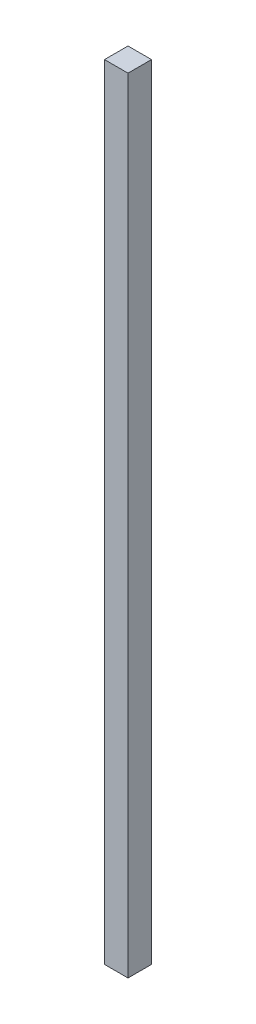
ISO-10303-21;
HEADER;
FILE_DESCRIPTION(('STEP AP214'),'2;1');
FILE_NAME('part.step','',(''),(''),'','','');
FILE_SCHEMA(('AUTOMOTIVE_DESIGN { 1 0 10303 214 1 1 1 1 }'));
ENDSEC;
DATA;
#1=APPLICATION_CONTEXT('core data for automotive mechanical design processes');
#2=APPLICATION_PROTOCOL_DEFINITION('international standard','automotive_design',2000,#1);
#3=PRODUCT_CONTEXT('',#1,'mechanical');
#4=PRODUCT('Part','Part','',(#3));
#5=PRODUCT_RELATED_PRODUCT_CATEGORY('part','',(#4));
#6=PRODUCT_DEFINITION_FORMATION('','',#4);
#7=PRODUCT_DEFINITION_CONTEXT('part definition',#1,'design');
#8=PRODUCT_DEFINITION('design','',#6,#7);
#9=PRODUCT_DEFINITION_SHAPE('','',#8);
#10=(LENGTH_UNIT() NAMED_UNIT(*) SI_UNIT(.MILLI.,.METRE.));
#11=(NAMED_UNIT(*) PLANE_ANGLE_UNIT() SI_UNIT($,.RADIAN.));
#12=(NAMED_UNIT(*) SI_UNIT($,.STERADIAN.) SOLID_ANGLE_UNIT());
#13=UNCERTAINTY_MEASURE_WITH_UNIT(LENGTH_MEASURE(1.E-05),#10,'distance_accuracy_value','');
#14=(GEOMETRIC_REPRESENTATION_CONTEXT(3) GLOBAL_UNCERTAINTY_ASSIGNED_CONTEXT((#13)) GLOBAL_UNIT_ASSIGNED_CONTEXT((#10,
#11,#12)) REPRESENTATION_CONTEXT('',''));
#15=CARTESIAN_POINT('',(0.,0.,0.));
#16=DIRECTION('',(0.,0.,1.));
#17=DIRECTION('',(1.,0.,0.));
#18=AXIS2_PLACEMENT_3D('',#15,#16,#17);
#19=CARTESIAN_POINT('',(0.,1000.,0.));
#20=DIRECTION('',(1.,0.,0.));
#21=DIRECTION('',(0.,0.,-1.));
#22=AXIS2_PLACEMENT_3D('',#19,#20,#21);
#23=PLANE('',#22);
#24=DIRECTION('',(0.,0.,1.));
#25=VECTOR('',#24,1.);
#26=CARTESIAN_POINT('',(0.,0.,0.));
#27=LINE('',#26,#25);
#28=CARTESIAN_POINT('',(0.,0.,-30.));
#29=VERTEX_POINT('',#28);
#30=CARTESIAN_POINT('',(0.,0.,0.));
#31=VERTEX_POINT('',#30);
#32=EDGE_CURVE('E107',#29,#31,#27,.T.);
#33=ORIENTED_EDGE('',*,*,#32,.T.);
#34=DIRECTION('',(0.,-1.,0.));
#35=VECTOR('',#34,1.);
#36=CARTESIAN_POINT('',(0.,1000.,0.));
#37=LINE('',#36,#35);
#38=CARTESIAN_POINT('',(0.,1000.,0.));
#39=VERTEX_POINT('',#38);
#40=EDGE_CURVE('E11',#39,#31,#37,.T.);
#41=ORIENTED_EDGE('',*,*,#40,.F.);
#42=DIRECTION('',(0.,0.,1.));
#43=VECTOR('',#42,1.);
#44=CARTESIAN_POINT('',(0.,1000.,0.));
#45=LINE('',#44,#43);
#46=CARTESIAN_POINT('',(0.,1000.,-30.));
#47=VERTEX_POINT('',#46);
#48=EDGE_CURVE('E91',#47,#39,#45,.T.);
#49=ORIENTED_EDGE('',*,*,#48,.F.);
#50=DIRECTION('',(0.,-1.,0.));
#51=VECTOR('',#50,1.);
#52=CARTESIAN_POINT('',(0.,1000.,-30.));
#53=LINE('',#52,#51);
#54=EDGE_CURVE('E103',#47,#29,#53,.T.);
#55=ORIENTED_EDGE('',*,*,#54,.T.);
#56=EDGE_LOOP('',(#33,#41,#49,#55));
#57=FACE_BOUND('',#56,.T.);
#58=ADVANCED_FACE('F39',(#57),#23,.F.);
#59=CARTESIAN_POINT('',(0.,1000.,0.));
#60=DIRECTION('',(0.,0.,-1.));
#61=DIRECTION('',(-1.,0.,0.));
#62=AXIS2_PLACEMENT_3D('',#59,#60,#61);
#63=PLANE('',#62);
#64=DIRECTION('',(1.,0.,0.));
#65=VECTOR('',#64,1.);
#66=CARTESIAN_POINT('',(0.,0.,0.));
#67=LINE('',#66,#65);
#68=CARTESIAN_POINT('',(30.,0.,0.));
#69=VERTEX_POINT('',#68);
#70=EDGE_CURVE('E96',#31,#69,#67,.T.);
#71=ORIENTED_EDGE('',*,*,#70,.T.);
#72=DIRECTION('',(0.,-1.,0.));
#73=VECTOR('',#72,1.);
#74=CARTESIAN_POINT('',(30.,1000.,0.));
#75=LINE('',#74,#73);
#76=CARTESIAN_POINT('',(30.,1000.,0.));
#77=VERTEX_POINT('',#76);
#78=EDGE_CURVE('E48',#77,#69,#75,.T.);
#79=ORIENTED_EDGE('',*,*,#78,.F.);
#80=DIRECTION('',(1.,0.,0.));
#81=VECTOR('',#80,1.);
#82=CARTESIAN_POINT('',(0.,1000.,0.));
#83=LINE('',#82,#81);
#84=EDGE_CURVE('E86',#39,#77,#83,.T.);
#85=ORIENTED_EDGE('',*,*,#84,.F.);
#86=ORIENTED_EDGE('',*,*,#40,.T.);
#87=EDGE_LOOP('',(#71,#79,#85,#86));
#88=FACE_BOUND('',#87,.T.);
#89=ADVANCED_FACE('F95',(#88),#63,.F.);
#90=CARTESIAN_POINT('',(30.,1000.,0.));
#91=DIRECTION('',(-1.,0.,0.));
#92=DIRECTION('',(0.,0.,1.));
#93=AXIS2_PLACEMENT_3D('',#90,#91,#92);
#94=PLANE('',#93);
#95=DIRECTION('',(0.,0.,-1.));
#96=VECTOR('',#95,1.);
#97=CARTESIAN_POINT('',(30.,0.,0.));
#98=LINE('',#97,#96);
#99=CARTESIAN_POINT('',(30.,0.,-30.));
#100=VERTEX_POINT('',#99);
#101=EDGE_CURVE('E73',#69,#100,#98,.T.);
#102=ORIENTED_EDGE('',*,*,#101,.T.);
#103=DIRECTION('',(0.,-1.,0.));
#104=VECTOR('',#103,1.);
#105=CARTESIAN_POINT('',(30.,1000.,-30.));
#106=LINE('',#105,#104);
#107=CARTESIAN_POINT('',(30.,1000.,-30.));
#108=VERTEX_POINT('',#107);
#109=EDGE_CURVE('E98',#108,#100,#106,.T.);
#110=ORIENTED_EDGE('',*,*,#109,.F.);
#111=DIRECTION('',(0.,0.,-1.));
#112=VECTOR('',#111,1.);
#113=CARTESIAN_POINT('',(30.,1000.,0.));
#114=LINE('',#113,#112);
#115=EDGE_CURVE('E89',#77,#108,#114,.T.);
#116=ORIENTED_EDGE('',*,*,#115,.F.);
#117=ORIENTED_EDGE('',*,*,#78,.T.);
#118=EDGE_LOOP('',(#102,#110,#116,#117));
#119=FACE_BOUND('',#118,.T.);
#120=ADVANCED_FACE('F99',(#119),#94,.F.);
#121=CARTESIAN_POINT('',(0.,1000.,-30.));
#122=DIRECTION('',(0.,0.,1.));
#123=DIRECTION('',(1.,0.,0.));
#124=AXIS2_PLACEMENT_3D('',#121,#122,#123);
#125=PLANE('',#124);
#126=DIRECTION('',(-1.,0.,0.));
#127=VECTOR('',#126,1.);
#128=CARTESIAN_POINT('',(0.,0.,-30.));
#129=LINE('',#128,#127);
#130=EDGE_CURVE('E79',#100,#29,#129,.T.);
#131=ORIENTED_EDGE('',*,*,#130,.T.);
#132=ORIENTED_EDGE('',*,*,#54,.F.);
#133=DIRECTION('',(-1.,0.,0.));
#134=VECTOR('',#133,1.);
#135=CARTESIAN_POINT('',(0.,1000.,-30.));
#136=LINE('',#135,#134);
#137=EDGE_CURVE('E56',#108,#47,#136,.T.);
#138=ORIENTED_EDGE('',*,*,#137,.F.);
#139=ORIENTED_EDGE('',*,*,#109,.T.);
#140=EDGE_LOOP('',(#131,#132,#138,#139));
#141=FACE_BOUND('',#140,.T.);
#142=ADVANCED_FACE('F120',(#141),#125,.F.);
#143=CARTESIAN_POINT('',(0.,1000.,0.));
#144=DIRECTION('',(0.,-1.,0.));
#145=DIRECTION('',(0.,0.,-1.));
#146=AXIS2_PLACEMENT_3D('',#143,#144,#145);
#147=PLANE('',#146);
#148=ORIENTED_EDGE('',*,*,#48,.T.);
#149=ORIENTED_EDGE('',*,*,#84,.T.);
#150=ORIENTED_EDGE('',*,*,#115,.T.);
#151=ORIENTED_EDGE('',*,*,#137,.T.);
#152=EDGE_LOOP('',(#148,#149,#150,#151));
#153=FACE_BOUND('',#152,.T.);
#154=ADVANCED_FACE('F87',(#153),#147,.F.);
#155=CARTESIAN_POINT('',(0.,0.,0.));
#156=DIRECTION('',(0.,-1.,0.));
#157=DIRECTION('',(0.,0.,-1.));
#158=AXIS2_PLACEMENT_3D('',#155,#156,#157);
#159=PLANE('',#158);
#160=ORIENTED_EDGE('',*,*,#32,.F.);
#161=ORIENTED_EDGE('',*,*,#130,.F.);
#162=ORIENTED_EDGE('',*,*,#101,.F.);
#163=ORIENTED_EDGE('',*,*,#70,.F.);
#164=EDGE_LOOP('',(#160,#161,#162,#163));
#165=FACE_BOUND('',#164,.T.);
#166=ADVANCED_FACE('F123',(#165),#159,.T.);
#167=CLOSED_SHELL('',(#58,#89,#120,#142,#154,#166));
#168=MANIFOLD_SOLID_BREP('B2',#167);
#169=ADVANCED_BREP_SHAPE_REPRESENTATION('',(#18,#168),#14);
#170=SHAPE_DEFINITION_REPRESENTATION(#9,#169);
ENDSEC;
END-ISO-10303-21;
